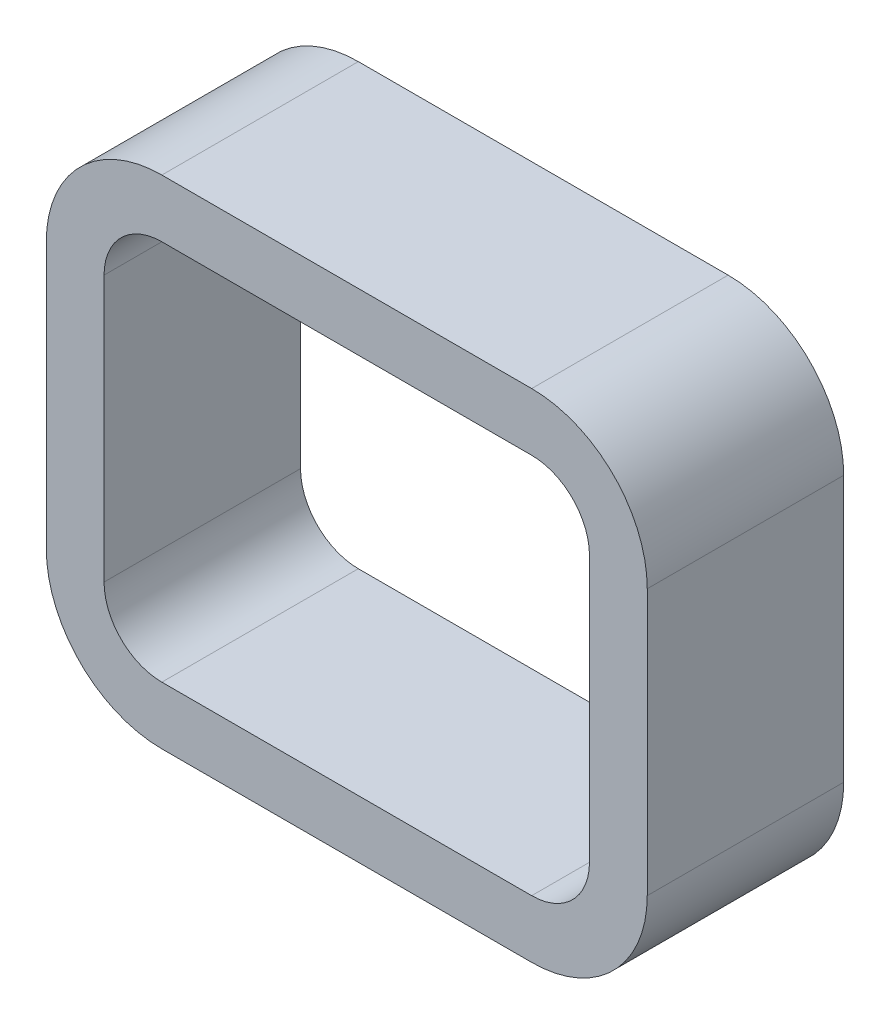
ISO-10303-21;
HEADER;
FILE_DESCRIPTION(('STEP AP214'),'2;1');
FILE_NAME('part.step','',(''),(''),'','','');
FILE_SCHEMA(('AUTOMOTIVE_DESIGN { 1 0 10303 214 1 1 1 1 }'));
ENDSEC;
DATA;
#1=APPLICATION_CONTEXT('core data for automotive mechanical design processes');
#2=APPLICATION_PROTOCOL_DEFINITION('international standard','automotive_design',2000,#1);
#3=PRODUCT_CONTEXT('',#1,'mechanical');
#4=PRODUCT('Part','Part','',(#3));
#5=PRODUCT_RELATED_PRODUCT_CATEGORY('part','',(#4));
#6=PRODUCT_DEFINITION_FORMATION('','',#4);
#7=PRODUCT_DEFINITION_CONTEXT('part definition',#1,'design');
#8=PRODUCT_DEFINITION('design','',#6,#7);
#9=PRODUCT_DEFINITION_SHAPE('','',#8);
#10=(LENGTH_UNIT() NAMED_UNIT(*) SI_UNIT(.MILLI.,.METRE.));
#11=(NAMED_UNIT(*) PLANE_ANGLE_UNIT() SI_UNIT($,.RADIAN.));
#12=(NAMED_UNIT(*) SI_UNIT($,.STERADIAN.) SOLID_ANGLE_UNIT());
#13=UNCERTAINTY_MEASURE_WITH_UNIT(LENGTH_MEASURE(1.E-05),#10,'distance_accuracy_value','');
#14=(GEOMETRIC_REPRESENTATION_CONTEXT(3) GLOBAL_UNCERTAINTY_ASSIGNED_CONTEXT((#13)) GLOBAL_UNIT_ASSIGNED_CONTEXT((#10,
#11,#12)) REPRESENTATION_CONTEXT('',''));
#15=CARTESIAN_POINT('',(0.,0.,0.));
#16=DIRECTION('',(0.,0.,1.));
#17=DIRECTION('',(1.,0.,0.));
#18=AXIS2_PLACEMENT_3D('',#15,#16,#17);
#19=CARTESIAN_POINT('',(-33.2076790853855,15.8631656598667,17.));
#20=DIRECTION('',(0.,0.,1.));
#21=DIRECTION('',(1.,0.,0.));
#22=AXIS2_PLACEMENT_3D('',#19,#20,#21);
#23=PLANE('',#22);
#24=CARTESIAN_POINT('',(-33.2076790853855,15.8631656598667,17.));
#25=DIRECTION('',(0.,0.,1.));
#26=DIRECTION('',(1.,0.,0.));
#27=AXIS2_PLACEMENT_3D('',#24,#25,#26);
#28=CIRCLE('',#27,10.);
#29=CARTESIAN_POINT('',(-33.2076790853855,25.8631656598667,17.));
#30=VERTEX_POINT('',#29);
#31=CARTESIAN_POINT('',(-43.2076790853855,15.8631656598667,17.));
#32=VERTEX_POINT('',#31);
#33=EDGE_CURVE('E258',#30,#32,#28,.T.);
#34=ORIENTED_EDGE('',*,*,#33,.T.);
#35=DIRECTION('',(0.,-1.,0.));
#36=VECTOR('',#35,1.);
#37=CARTESIAN_POINT('',(-43.2076790853855,15.8631656598667,17.));
#38=LINE('',#37,#36);
#39=CARTESIAN_POINT('',(-43.2076790853855,-7.13683434013332,17.));
#40=VERTEX_POINT('',#39);
#41=EDGE_CURVE('E261',#32,#40,#38,.T.);
#42=ORIENTED_EDGE('',*,*,#41,.T.);
#43=CARTESIAN_POINT('',(-33.2076790853855,-7.13683434013332,17.));
#44=DIRECTION('',(0.,0.,1.));
#45=DIRECTION('',(1.,0.,0.));
#46=AXIS2_PLACEMENT_3D('',#43,#44,#45);
#47=CIRCLE('',#46,10.);
#48=CARTESIAN_POINT('',(-33.2076790853855,-17.1368343401333,17.));
#49=VERTEX_POINT('',#48);
#50=EDGE_CURVE('E264',#40,#49,#47,.T.);
#51=ORIENTED_EDGE('',*,*,#50,.T.);
#52=DIRECTION('',(1.,0.,0.));
#53=VECTOR('',#52,1.);
#54=CARTESIAN_POINT('',(-1.20767908538554,-17.1368343401333,17.));
#55=LINE('',#54,#53);
#56=CARTESIAN_POINT('',(-1.20767908538554,-17.1368343401333,17.));
#57=VERTEX_POINT('',#56);
#58=EDGE_CURVE('E266',#49,#57,#55,.T.);
#59=ORIENTED_EDGE('',*,*,#58,.T.);
#60=CARTESIAN_POINT('',(-1.20767908538554,-7.13683434013332,17.));
#61=DIRECTION('',(0.,0.,1.));
#62=DIRECTION('',(1.,0.,0.));
#63=AXIS2_PLACEMENT_3D('',#60,#61,#62);
#64=CIRCLE('',#63,10.);
#65=CARTESIAN_POINT('',(8.79232091461447,-7.13683434013331,17.));
#66=VERTEX_POINT('',#65);
#67=EDGE_CURVE('E268',#57,#66,#64,.T.);
#68=ORIENTED_EDGE('',*,*,#67,.T.);
#69=DIRECTION('',(0.,1.,0.));
#70=VECTOR('',#69,1.);
#71=CARTESIAN_POINT('',(8.79232091461446,15.8631656598667,17.));
#72=LINE('',#71,#70);
#73=CARTESIAN_POINT('',(8.79232091461446,15.8631656598667,17.));
#74=VERTEX_POINT('',#73);
#75=EDGE_CURVE('E270',#66,#74,#72,.T.);
#76=ORIENTED_EDGE('',*,*,#75,.T.);
#77=CARTESIAN_POINT('',(-1.20767908538554,15.8631656598667,17.));
#78=DIRECTION('',(0.,0.,1.));
#79=DIRECTION('',(1.,0.,0.));
#80=AXIS2_PLACEMENT_3D('',#77,#78,#79);
#81=CIRCLE('',#80,10.);
#82=CARTESIAN_POINT('',(-1.20767908538554,25.8631656598667,17.));
#83=VERTEX_POINT('',#82);
#84=EDGE_CURVE('E272',#74,#83,#81,.T.);
#85=ORIENTED_EDGE('',*,*,#84,.T.);
#86=DIRECTION('',(-1.,0.,0.));
#87=VECTOR('',#86,1.);
#88=CARTESIAN_POINT('',(-1.20767908538554,25.8631656598667,17.));
#89=LINE('',#88,#87);
#90=EDGE_CURVE('E274',#83,#30,#89,.T.);
#91=ORIENTED_EDGE('',*,*,#90,.T.);
#92=EDGE_LOOP('',(#34,#42,#51,#59,#68,#76,#85,#91));
#93=FACE_BOUND('',#92,.T.);
#94=DIRECTION('',(0.,-1.,0.));
#95=VECTOR('',#94,1.);
#96=CARTESIAN_POINT('',(-38.2076790853855,15.8631656598667,17.));
#97=LINE('',#96,#95);
#98=CARTESIAN_POINT('',(-38.2076790853855,15.8631656598667,17.));
#99=VERTEX_POINT('',#98);
#100=CARTESIAN_POINT('',(-38.2076790853855,-7.13683434013332,17.));
#101=VERTEX_POINT('',#100);
#102=EDGE_CURVE('E201',#99,#101,#97,.T.);
#103=ORIENTED_EDGE('',*,*,#102,.F.);
#104=CARTESIAN_POINT('',(-33.2076790853855,15.8631656598667,17.));
#105=DIRECTION('',(0.,0.,1.));
#106=DIRECTION('',(1.,0.,0.));
#107=AXIS2_PLACEMENT_3D('',#104,#105,#106);
#108=CIRCLE('',#107,5.);
#109=CARTESIAN_POINT('',(-33.2076790853855,20.8631656598667,17.));
#110=VERTEX_POINT('',#109);
#111=EDGE_CURVE('E193',#110,#99,#108,.T.);
#112=ORIENTED_EDGE('',*,*,#111,.F.);
#113=DIRECTION('',(-1.,0.,0.));
#114=VECTOR('',#113,1.);
#115=CARTESIAN_POINT('',(-1.20767908538554,20.8631656598667,17.));
#116=LINE('',#115,#114);
#117=CARTESIAN_POINT('',(-1.20767908538554,20.8631656598667,17.));
#118=VERTEX_POINT('',#117);
#119=EDGE_CURVE('E226',#118,#110,#116,.T.);
#120=ORIENTED_EDGE('',*,*,#119,.F.);
#121=CARTESIAN_POINT('',(-1.20767908538554,15.8631656598667,17.));
#122=DIRECTION('',(0.,0.,1.));
#123=DIRECTION('',(-1.,0.,0.));
#124=AXIS2_PLACEMENT_3D('',#121,#122,#123);
#125=CIRCLE('',#124,5.);
#126=CARTESIAN_POINT('',(3.79232091461446,15.8631656598667,17.));
#127=VERTEX_POINT('',#126);
#128=EDGE_CURVE('E224',#127,#118,#125,.T.);
#129=ORIENTED_EDGE('',*,*,#128,.F.);
#130=DIRECTION('',(0.,1.,0.));
#131=VECTOR('',#130,1.);
#132=CARTESIAN_POINT('',(3.79232091461446,15.8631656598667,17.));
#133=LINE('',#132,#131);
#134=CARTESIAN_POINT('',(3.79232091461446,-7.13683434013332,17.));
#135=VERTEX_POINT('',#134);
#136=EDGE_CURVE('E222',#135,#127,#133,.T.);
#137=ORIENTED_EDGE('',*,*,#136,.F.);
#138=CARTESIAN_POINT('',(-1.20767908538554,-7.13683434013332,17.));
#139=DIRECTION('',(0.,0.,1.));
#140=DIRECTION('',(-1.,0.,0.));
#141=AXIS2_PLACEMENT_3D('',#138,#139,#140);
#142=CIRCLE('',#141,5.);
#143=CARTESIAN_POINT('',(-1.20767908538554,-12.1368343401333,17.));
#144=VERTEX_POINT('',#143);
#145=EDGE_CURVE('E220',#144,#135,#142,.T.);
#146=ORIENTED_EDGE('',*,*,#145,.F.);
#147=DIRECTION('',(1.,0.,0.));
#148=VECTOR('',#147,1.);
#149=CARTESIAN_POINT('',(-1.20767908538554,-12.1368343401333,17.));
#150=LINE('',#149,#148);
#151=CARTESIAN_POINT('',(-33.2076790853855,-12.1368343401333,17.));
#152=VERTEX_POINT('',#151);
#153=EDGE_CURVE('E216',#152,#144,#150,.T.);
#154=ORIENTED_EDGE('',*,*,#153,.F.);
#155=CARTESIAN_POINT('',(-33.2076790853855,-7.13683434013332,17.));
#156=DIRECTION('',(0.,0.,1.));
#157=DIRECTION('',(-1.,0.,0.));
#158=AXIS2_PLACEMENT_3D('',#155,#156,#157);
#159=CIRCLE('',#158,5.00000000000001);
#160=EDGE_CURVE('E214',#101,#152,#159,.T.);
#161=ORIENTED_EDGE('',*,*,#160,.F.);
#162=EDGE_LOOP('',(#103,#112,#120,#129,#137,#146,#154,#161));
#163=FACE_BOUND('',#162,.T.);
#164=ADVANCED_FACE('F80',(#93,#163),#23,.T.);
#165=CARTESIAN_POINT('',(-33.2076790853855,15.8631656598667,0.));
#166=DIRECTION('',(0.,0.,1.));
#167=DIRECTION('',(1.,0.,0.));
#168=AXIS2_PLACEMENT_3D('',#165,#166,#167);
#169=PLANE('',#168);
#170=CARTESIAN_POINT('',(-33.2076790853855,15.8631656598667,0.));
#171=DIRECTION('',(0.,0.,1.));
#172=DIRECTION('',(1.,0.,0.));
#173=AXIS2_PLACEMENT_3D('',#170,#171,#172);
#174=CIRCLE('',#173,10.);
#175=CARTESIAN_POINT('',(-33.2076790853855,25.8631656598667,0.));
#176=VERTEX_POINT('',#175);
#177=CARTESIAN_POINT('',(-43.2076790853855,15.8631656598667,0.));
#178=VERTEX_POINT('',#177);
#179=EDGE_CURVE('E209',#176,#178,#174,.T.);
#180=ORIENTED_EDGE('',*,*,#179,.F.);
#181=DIRECTION('',(-1.,0.,0.));
#182=VECTOR('',#181,1.);
#183=CARTESIAN_POINT('',(-1.20767908538554,25.8631656598667,0.));
#184=LINE('',#183,#182);
#185=CARTESIAN_POINT('',(-1.20767908538554,25.8631656598667,0.));
#186=VERTEX_POINT('',#185);
#187=EDGE_CURVE('E262',#186,#176,#184,.T.);
#188=ORIENTED_EDGE('',*,*,#187,.F.);
#189=CARTESIAN_POINT('',(-1.20767908538554,15.8631656598667,0.));
#190=DIRECTION('',(0.,0.,1.));
#191=DIRECTION('',(1.,0.,0.));
#192=AXIS2_PLACEMENT_3D('',#189,#190,#191);
#193=CIRCLE('',#192,10.);
#194=CARTESIAN_POINT('',(8.79232091461446,15.8631656598667,0.));
#195=VERTEX_POINT('',#194);
#196=EDGE_CURVE('E289',#195,#186,#193,.T.);
#197=ORIENTED_EDGE('',*,*,#196,.F.);
#198=DIRECTION('',(0.,1.,0.));
#199=VECTOR('',#198,1.);
#200=CARTESIAN_POINT('',(8.79232091461446,15.8631656598667,0.));
#201=LINE('',#200,#199);
#202=CARTESIAN_POINT('',(8.79232091461447,-7.13683434013331,0.));
#203=VERTEX_POINT('',#202);
#204=EDGE_CURVE('E287',#203,#195,#201,.T.);
#205=ORIENTED_EDGE('',*,*,#204,.F.);
#206=CARTESIAN_POINT('',(-1.20767908538554,-7.13683434013332,0.));
#207=DIRECTION('',(0.,0.,1.));
#208=DIRECTION('',(1.,0.,0.));
#209=AXIS2_PLACEMENT_3D('',#206,#207,#208);
#210=CIRCLE('',#209,10.);
#211=CARTESIAN_POINT('',(-1.20767908538554,-17.1368343401333,0.));
#212=VERTEX_POINT('',#211);
#213=EDGE_CURVE('E285',#212,#203,#210,.T.);
#214=ORIENTED_EDGE('',*,*,#213,.F.);
#215=DIRECTION('',(1.,0.,0.));
#216=VECTOR('',#215,1.);
#217=CARTESIAN_POINT('',(-1.20767908538554,-17.1368343401333,0.));
#218=LINE('',#217,#216);
#219=CARTESIAN_POINT('',(-33.2076790853855,-17.1368343401333,0.));
#220=VERTEX_POINT('',#219);
#221=EDGE_CURVE('E283',#220,#212,#218,.T.);
#222=ORIENTED_EDGE('',*,*,#221,.F.);
#223=CARTESIAN_POINT('',(-33.2076790853855,-7.13683434013332,0.));
#224=DIRECTION('',(0.,0.,1.));
#225=DIRECTION('',(1.,0.,0.));
#226=AXIS2_PLACEMENT_3D('',#223,#224,#225);
#227=CIRCLE('',#226,10.);
#228=CARTESIAN_POINT('',(-43.2076790853855,-7.13683434013332,0.));
#229=VERTEX_POINT('',#228);
#230=EDGE_CURVE('E281',#229,#220,#227,.T.);
#231=ORIENTED_EDGE('',*,*,#230,.F.);
#232=DIRECTION('',(0.,-1.,0.));
#233=VECTOR('',#232,1.);
#234=CARTESIAN_POINT('',(-43.2076790853855,15.8631656598667,0.));
#235=LINE('',#234,#233);
#236=EDGE_CURVE('E279',#178,#229,#235,.T.);
#237=ORIENTED_EDGE('',*,*,#236,.F.);
#238=EDGE_LOOP('',(#180,#188,#197,#205,#214,#222,#231,#237));
#239=FACE_BOUND('',#238,.T.);
#240=CARTESIAN_POINT('',(-33.2076790853855,15.8631656598667,0.));
#241=DIRECTION('',(0.,0.,1.));
#242=DIRECTION('',(1.,0.,0.));
#243=AXIS2_PLACEMENT_3D('',#240,#241,#242);
#244=CIRCLE('',#243,5.);
#245=CARTESIAN_POINT('',(-33.2076790853855,20.8631656598667,0.));
#246=VERTEX_POINT('',#245);
#247=CARTESIAN_POINT('',(-38.2076790853855,15.8631656598667,0.));
#248=VERTEX_POINT('',#247);
#249=EDGE_CURVE('E103',#246,#248,#244,.T.);
#250=ORIENTED_EDGE('',*,*,#249,.T.);
#251=DIRECTION('',(0.,-1.,0.));
#252=VECTOR('',#251,1.);
#253=CARTESIAN_POINT('',(-38.2076790853855,15.8631656598667,0.));
#254=LINE('',#253,#252);
#255=CARTESIAN_POINT('',(-38.2076790853855,-7.13683434013332,0.));
#256=VERTEX_POINT('',#255);
#257=EDGE_CURVE('E208',#248,#256,#254,.T.);
#258=ORIENTED_EDGE('',*,*,#257,.T.);
#259=CARTESIAN_POINT('',(-33.2076790853855,-7.13683434013332,0.));
#260=DIRECTION('',(0.,0.,1.));
#261=DIRECTION('',(-1.,0.,0.));
#262=AXIS2_PLACEMENT_3D('',#259,#260,#261);
#263=CIRCLE('',#262,5.00000000000001);
#264=CARTESIAN_POINT('',(-33.2076790853855,-12.1368343401333,0.));
#265=VERTEX_POINT('',#264);
#266=EDGE_CURVE('E230',#256,#265,#263,.T.);
#267=ORIENTED_EDGE('',*,*,#266,.T.);
#268=DIRECTION('',(1.,0.,0.));
#269=VECTOR('',#268,1.);
#270=CARTESIAN_POINT('',(-1.20767908538554,-12.1368343401333,0.));
#271=LINE('',#270,#269);
#272=CARTESIAN_POINT('',(-1.20767908538554,-12.1368343401333,0.));
#273=VERTEX_POINT('',#272);
#274=EDGE_CURVE('E233',#265,#273,#271,.T.);
#275=ORIENTED_EDGE('',*,*,#274,.T.);
#276=CARTESIAN_POINT('',(-1.20767908538554,-7.13683434013332,0.));
#277=DIRECTION('',(0.,0.,1.));
#278=DIRECTION('',(-1.,0.,0.));
#279=AXIS2_PLACEMENT_3D('',#276,#277,#278);
#280=CIRCLE('',#279,5.);
#281=CARTESIAN_POINT('',(3.79232091461446,-7.13683434013332,0.));
#282=VERTEX_POINT('',#281);
#283=EDGE_CURVE('E236',#273,#282,#280,.T.);
#284=ORIENTED_EDGE('',*,*,#283,.T.);
#285=DIRECTION('',(0.,1.,0.));
#286=VECTOR('',#285,1.);
#287=CARTESIAN_POINT('',(3.79232091461446,15.8631656598667,0.));
#288=LINE('',#287,#286);
#289=CARTESIAN_POINT('',(3.79232091461446,15.8631656598667,0.));
#290=VERTEX_POINT('',#289);
#291=EDGE_CURVE('E239',#282,#290,#288,.T.);
#292=ORIENTED_EDGE('',*,*,#291,.T.);
#293=CARTESIAN_POINT('',(-1.20767908538554,15.8631656598667,0.));
#294=DIRECTION('',(0.,0.,1.));
#295=DIRECTION('',(-1.,0.,0.));
#296=AXIS2_PLACEMENT_3D('',#293,#294,#295);
#297=CIRCLE('',#296,5.);
#298=CARTESIAN_POINT('',(-1.20767908538554,20.8631656598667,0.));
#299=VERTEX_POINT('',#298);
#300=EDGE_CURVE('E242',#290,#299,#297,.T.);
#301=ORIENTED_EDGE('',*,*,#300,.T.);
#302=DIRECTION('',(-1.,0.,0.));
#303=VECTOR('',#302,1.);
#304=CARTESIAN_POINT('',(-1.20767908538554,20.8631656598667,0.));
#305=LINE('',#304,#303);
#306=EDGE_CURVE('E202',#299,#246,#305,.T.);
#307=ORIENTED_EDGE('',*,*,#306,.T.);
#308=EDGE_LOOP('',(#250,#258,#267,#275,#284,#292,#301,#307));
#309=FACE_BOUND('',#308,.T.);
#310=ADVANCED_FACE('F319',(#239,#309),#169,.F.);
#311=CARTESIAN_POINT('',(-33.2076790853855,15.8631656598667,17.));
#312=DIRECTION('',(0.,0.,-1.));
#313=DIRECTION('',(-1.,0.,0.));
#314=AXIS2_PLACEMENT_3D('',#311,#312,#313);
#315=CYLINDRICAL_SURFACE('',#314,10.);
#316=ORIENTED_EDGE('',*,*,#179,.T.);
#317=DIRECTION('',(0.,0.,-1.));
#318=VECTOR('',#317,1.);
#319=CARTESIAN_POINT('',(-43.2076790853855,15.8631656598667,17.));
#320=LINE('',#319,#318);
#321=EDGE_CURVE('E12',#32,#178,#320,.T.);
#322=ORIENTED_EDGE('',*,*,#321,.F.);
#323=ORIENTED_EDGE('',*,*,#33,.F.);
#324=DIRECTION('',(0.,0.,-1.));
#325=VECTOR('',#324,1.);
#326=CARTESIAN_POINT('',(-33.2076790853855,25.8631656598667,17.));
#327=LINE('',#326,#325);
#328=EDGE_CURVE('E276',#30,#176,#327,.T.);
#329=ORIENTED_EDGE('',*,*,#328,.T.);
#330=EDGE_LOOP('',(#316,#322,#323,#329));
#331=FACE_BOUND('',#330,.T.);
#332=ADVANCED_FACE('F82',(#331),#315,.T.);
#333=CARTESIAN_POINT('',(-43.2076790853855,15.8631656598667,17.));
#334=DIRECTION('',(1.,0.,0.));
#335=DIRECTION('',(0.,1.,0.));
#336=AXIS2_PLACEMENT_3D('',#333,#334,#335);
#337=PLANE('',#336);
#338=ORIENTED_EDGE('',*,*,#236,.T.);
#339=DIRECTION('',(0.,0.,-1.));
#340=VECTOR('',#339,1.);
#341=CARTESIAN_POINT('',(-43.2076790853855,-7.13683434013332,17.));
#342=LINE('',#341,#340);
#343=EDGE_CURVE('E88',#40,#229,#342,.T.);
#344=ORIENTED_EDGE('',*,*,#343,.F.);
#345=ORIENTED_EDGE('',*,*,#41,.F.);
#346=ORIENTED_EDGE('',*,*,#321,.T.);
#347=EDGE_LOOP('',(#338,#344,#345,#346));
#348=FACE_BOUND('',#347,.T.);
#349=ADVANCED_FACE('F336',(#348),#337,.F.);
#350=CARTESIAN_POINT('',(-33.2076790853855,-7.13683434013332,17.));
#351=DIRECTION('',(0.,0.,-1.));
#352=DIRECTION('',(-1.,0.,0.));
#353=AXIS2_PLACEMENT_3D('',#350,#351,#352);
#354=CYLINDRICAL_SURFACE('',#353,10.);
#355=ORIENTED_EDGE('',*,*,#230,.T.);
#356=DIRECTION('',(0.,0.,-1.));
#357=VECTOR('',#356,1.);
#358=CARTESIAN_POINT('',(-33.2076790853855,-17.1368343401333,17.));
#359=LINE('',#358,#357);
#360=EDGE_CURVE('E306',#49,#220,#359,.T.);
#361=ORIENTED_EDGE('',*,*,#360,.F.);
#362=ORIENTED_EDGE('',*,*,#50,.F.);
#363=ORIENTED_EDGE('',*,*,#343,.T.);
#364=EDGE_LOOP('',(#355,#361,#362,#363));
#365=FACE_BOUND('',#364,.T.);
#366=ADVANCED_FACE('F313',(#365),#354,.T.);
#367=CARTESIAN_POINT('',(-1.20767908538554,-17.1368343401333,17.));
#368=DIRECTION('',(0.,1.,0.));
#369=DIRECTION('',(-1.,0.,0.));
#370=AXIS2_PLACEMENT_3D('',#367,#368,#369);
#371=PLANE('',#370);
#372=ORIENTED_EDGE('',*,*,#221,.T.);
#373=DIRECTION('',(0.,0.,-1.));
#374=VECTOR('',#373,1.);
#375=CARTESIAN_POINT('',(-1.20767908538554,-17.1368343401333,17.));
#376=LINE('',#375,#374);
#377=EDGE_CURVE('E303',#57,#212,#376,.T.);
#378=ORIENTED_EDGE('',*,*,#377,.F.);
#379=ORIENTED_EDGE('',*,*,#58,.F.);
#380=ORIENTED_EDGE('',*,*,#360,.T.);
#381=EDGE_LOOP('',(#372,#378,#379,#380));
#382=FACE_BOUND('',#381,.T.);
#383=ADVANCED_FACE('F325',(#382),#371,.F.);
#384=CARTESIAN_POINT('',(-1.20767908538554,-7.13683434013332,17.));
#385=DIRECTION('',(0.,0.,-1.));
#386=DIRECTION('',(-1.,0.,0.));
#387=AXIS2_PLACEMENT_3D('',#384,#385,#386);
#388=CYLINDRICAL_SURFACE('',#387,10.);
#389=ORIENTED_EDGE('',*,*,#213,.T.);
#390=DIRECTION('',(0.,0.,-1.));
#391=VECTOR('',#390,1.);
#392=CARTESIAN_POINT('',(8.79232091461447,-7.13683434013331,17.));
#393=LINE('',#392,#391);
#394=EDGE_CURVE('E300',#66,#203,#393,.T.);
#395=ORIENTED_EDGE('',*,*,#394,.F.);
#396=ORIENTED_EDGE('',*,*,#67,.F.);
#397=ORIENTED_EDGE('',*,*,#377,.T.);
#398=EDGE_LOOP('',(#389,#395,#396,#397));
#399=FACE_BOUND('',#398,.T.);
#400=ADVANCED_FACE('F329',(#399),#388,.T.);
#401=CARTESIAN_POINT('',(8.79232091461446,15.8631656598667,17.));
#402=DIRECTION('',(-1.,0.,0.));
#403=DIRECTION('',(0.,-1.,0.));
#404=AXIS2_PLACEMENT_3D('',#401,#402,#403);
#405=PLANE('',#404);
#406=ORIENTED_EDGE('',*,*,#204,.T.);
#407=DIRECTION('',(0.,0.,-1.));
#408=VECTOR('',#407,1.);
#409=CARTESIAN_POINT('',(8.79232091461446,15.8631656598667,17.));
#410=LINE('',#409,#408);
#411=EDGE_CURVE('E297',#74,#195,#410,.T.);
#412=ORIENTED_EDGE('',*,*,#411,.F.);
#413=ORIENTED_EDGE('',*,*,#75,.F.);
#414=ORIENTED_EDGE('',*,*,#394,.T.);
#415=EDGE_LOOP('',(#406,#412,#413,#414));
#416=FACE_BOUND('',#415,.T.);
#417=ADVANCED_FACE('F349',(#416),#405,.F.);
#418=CARTESIAN_POINT('',(-1.20767908538554,15.8631656598667,17.));
#419=DIRECTION('',(0.,0.,-1.));
#420=DIRECTION('',(-1.,0.,0.));
#421=AXIS2_PLACEMENT_3D('',#418,#419,#420);
#422=CYLINDRICAL_SURFACE('',#421,10.);
#423=ORIENTED_EDGE('',*,*,#196,.T.);
#424=DIRECTION('',(0.,0.,-1.));
#425=VECTOR('',#424,1.);
#426=CARTESIAN_POINT('',(-1.20767908538554,25.8631656598667,17.));
#427=LINE('',#426,#425);
#428=EDGE_CURVE('E294',#83,#186,#427,.T.);
#429=ORIENTED_EDGE('',*,*,#428,.F.);
#430=ORIENTED_EDGE('',*,*,#84,.F.);
#431=ORIENTED_EDGE('',*,*,#411,.T.);
#432=EDGE_LOOP('',(#423,#429,#430,#431));
#433=FACE_BOUND('',#432,.T.);
#434=ADVANCED_FACE('F347',(#433),#422,.T.);
#435=CARTESIAN_POINT('',(-1.20767908538554,25.8631656598667,17.));
#436=DIRECTION('',(0.,-1.,0.));
#437=DIRECTION('',(0.,0.,-1.));
#438=AXIS2_PLACEMENT_3D('',#435,#436,#437);
#439=PLANE('',#438);
#440=ORIENTED_EDGE('',*,*,#187,.T.);
#441=ORIENTED_EDGE('',*,*,#328,.F.);
#442=ORIENTED_EDGE('',*,*,#90,.F.);
#443=ORIENTED_EDGE('',*,*,#428,.T.);
#444=EDGE_LOOP('',(#440,#441,#442,#443));
#445=FACE_BOUND('',#444,.T.);
#446=ADVANCED_FACE('F342',(#445),#439,.F.);
#447=CARTESIAN_POINT('',(-33.2076790853855,15.8631656598667,17.));
#448=DIRECTION('',(0.,0.,-1.));
#449=DIRECTION('',(-1.,0.,0.));
#450=AXIS2_PLACEMENT_3D('',#447,#448,#449);
#451=CYLINDRICAL_SURFACE('',#450,5.);
#452=ORIENTED_EDGE('',*,*,#249,.F.);
#453=DIRECTION('',(0.,0.,-1.));
#454=VECTOR('',#453,1.);
#455=CARTESIAN_POINT('',(-33.2076790853855,20.8631656598667,17.));
#456=LINE('',#455,#454);
#457=EDGE_CURVE('E197',#110,#246,#456,.T.);
#458=ORIENTED_EDGE('',*,*,#457,.F.);
#459=ORIENTED_EDGE('',*,*,#111,.T.);
#460=DIRECTION('',(0.,0.,-1.));
#461=VECTOR('',#460,1.);
#462=CARTESIAN_POINT('',(-38.2076790853855,15.8631656598667,17.));
#463=LINE('',#462,#461);
#464=EDGE_CURVE('E196',#99,#248,#463,.T.);
#465=ORIENTED_EDGE('',*,*,#464,.T.);
#466=EDGE_LOOP('',(#452,#458,#459,#465));
#467=FACE_BOUND('',#466,.T.);
#468=ADVANCED_FACE('F195',(#467),#451,.F.);
#469=CARTESIAN_POINT('',(-38.2076790853855,15.8631656598667,17.));
#470=DIRECTION('',(1.,0.,0.));
#471=DIRECTION('',(0.,1.,0.));
#472=AXIS2_PLACEMENT_3D('',#469,#470,#471);
#473=PLANE('',#472);
#474=ORIENTED_EDGE('',*,*,#257,.F.);
#475=ORIENTED_EDGE('',*,*,#464,.F.);
#476=ORIENTED_EDGE('',*,*,#102,.T.);
#477=DIRECTION('',(0.,0.,-1.));
#478=VECTOR('',#477,1.);
#479=CARTESIAN_POINT('',(-38.2076790853855,-7.13683434013332,17.));
#480=LINE('',#479,#478);
#481=EDGE_CURVE('E210',#101,#256,#480,.T.);
#482=ORIENTED_EDGE('',*,*,#481,.T.);
#483=EDGE_LOOP('',(#474,#475,#476,#482));
#484=FACE_BOUND('',#483,.T.);
#485=ADVANCED_FACE('F205',(#484),#473,.T.);
#486=CARTESIAN_POINT('',(-33.2076790853855,-7.13683434013332,17.));
#487=DIRECTION('',(0.,0.,-1.));
#488=DIRECTION('',(-1.,0.,0.));
#489=AXIS2_PLACEMENT_3D('',#486,#487,#488);
#490=CYLINDRICAL_SURFACE('',#489,5.00000000000001);
#491=ORIENTED_EDGE('',*,*,#266,.F.);
#492=ORIENTED_EDGE('',*,*,#481,.F.);
#493=ORIENTED_EDGE('',*,*,#160,.T.);
#494=DIRECTION('',(0.,0.,-1.));
#495=VECTOR('',#494,1.);
#496=CARTESIAN_POINT('',(-33.2076790853855,-12.1368343401333,17.));
#497=LINE('',#496,#495);
#498=EDGE_CURVE('E255',#152,#265,#497,.T.);
#499=ORIENTED_EDGE('',*,*,#498,.T.);
#500=EDGE_LOOP('',(#491,#492,#493,#499));
#501=FACE_BOUND('',#500,.T.);
#502=ADVANCED_FACE('F374',(#501),#490,.F.);
#503=CARTESIAN_POINT('',(-1.20767908538554,-12.1368343401333,17.));
#504=DIRECTION('',(0.,1.,0.));
#505=DIRECTION('',(-1.,0.,0.));
#506=AXIS2_PLACEMENT_3D('',#503,#504,#505);
#507=PLANE('',#506);
#508=ORIENTED_EDGE('',*,*,#274,.F.);
#509=ORIENTED_EDGE('',*,*,#498,.F.);
#510=ORIENTED_EDGE('',*,*,#153,.T.);
#511=DIRECTION('',(0.,0.,-1.));
#512=VECTOR('',#511,1.);
#513=CARTESIAN_POINT('',(-1.20767908538554,-12.1368343401333,17.));
#514=LINE('',#513,#512);
#515=EDGE_CURVE('E253',#144,#273,#514,.T.);
#516=ORIENTED_EDGE('',*,*,#515,.T.);
#517=EDGE_LOOP('',(#508,#509,#510,#516));
#518=FACE_BOUND('',#517,.T.);
#519=ADVANCED_FACE('F378',(#518),#507,.T.);
#520=CARTESIAN_POINT('',(-1.20767908538554,-7.13683434013332,17.));
#521=DIRECTION('',(0.,0.,-1.));
#522=DIRECTION('',(-1.,0.,0.));
#523=AXIS2_PLACEMENT_3D('',#520,#521,#522);
#524=CYLINDRICAL_SURFACE('',#523,5.);
#525=ORIENTED_EDGE('',*,*,#283,.F.);
#526=ORIENTED_EDGE('',*,*,#515,.F.);
#527=ORIENTED_EDGE('',*,*,#145,.T.);
#528=DIRECTION('',(0.,0.,-1.));
#529=VECTOR('',#528,1.);
#530=CARTESIAN_POINT('',(3.79232091461446,-7.13683434013332,17.));
#531=LINE('',#530,#529);
#532=EDGE_CURVE('E251',#135,#282,#531,.T.);
#533=ORIENTED_EDGE('',*,*,#532,.T.);
#534=EDGE_LOOP('',(#525,#526,#527,#533));
#535=FACE_BOUND('',#534,.T.);
#536=ADVANCED_FACE('F384',(#535),#524,.F.);
#537=CARTESIAN_POINT('',(3.79232091461446,15.8631656598667,17.));
#538=DIRECTION('',(-1.,0.,0.));
#539=DIRECTION('',(0.,-1.,0.));
#540=AXIS2_PLACEMENT_3D('',#537,#538,#539);
#541=PLANE('',#540);
#542=ORIENTED_EDGE('',*,*,#291,.F.);
#543=ORIENTED_EDGE('',*,*,#532,.F.);
#544=ORIENTED_EDGE('',*,*,#136,.T.);
#545=DIRECTION('',(0.,0.,-1.));
#546=VECTOR('',#545,1.);
#547=CARTESIAN_POINT('',(3.79232091461446,15.8631656598667,17.));
#548=LINE('',#547,#546);
#549=EDGE_CURVE('E249',#127,#290,#548,.T.);
#550=ORIENTED_EDGE('',*,*,#549,.T.);
#551=EDGE_LOOP('',(#542,#543,#544,#550));
#552=FACE_BOUND('',#551,.T.);
#553=ADVANCED_FACE('F388',(#552),#541,.T.);
#554=CARTESIAN_POINT('',(-1.20767908538554,15.8631656598667,17.));
#555=DIRECTION('',(0.,0.,-1.));
#556=DIRECTION('',(-1.,0.,0.));
#557=AXIS2_PLACEMENT_3D('',#554,#555,#556);
#558=CYLINDRICAL_SURFACE('',#557,5.);
#559=ORIENTED_EDGE('',*,*,#300,.F.);
#560=ORIENTED_EDGE('',*,*,#549,.F.);
#561=ORIENTED_EDGE('',*,*,#128,.T.);
#562=DIRECTION('',(0.,0.,-1.));
#563=VECTOR('',#562,1.);
#564=CARTESIAN_POINT('',(-1.20767908538554,20.8631656598667,17.));
#565=LINE('',#564,#563);
#566=EDGE_CURVE('E95',#118,#299,#565,.T.);
#567=ORIENTED_EDGE('',*,*,#566,.T.);
#568=EDGE_LOOP('',(#559,#560,#561,#567));
#569=FACE_BOUND('',#568,.T.);
#570=ADVANCED_FACE('F392',(#569),#558,.F.);
#571=CARTESIAN_POINT('',(-1.20767908538554,20.8631656598667,17.));
#572=DIRECTION('',(0.,-1.,0.));
#573=DIRECTION('',(0.,0.,-1.));
#574=AXIS2_PLACEMENT_3D('',#571,#572,#573);
#575=PLANE('',#574);
#576=ORIENTED_EDGE('',*,*,#306,.F.);
#577=ORIENTED_EDGE('',*,*,#566,.F.);
#578=ORIENTED_EDGE('',*,*,#119,.T.);
#579=ORIENTED_EDGE('',*,*,#457,.T.);
#580=EDGE_LOOP('',(#576,#577,#578,#579));
#581=FACE_BOUND('',#580,.T.);
#582=ADVANCED_FACE('F396',(#581),#575,.T.);
#583=CLOSED_SHELL('',(#164,#310,#332,#349,#366,#383,#400,#417,#434,#446,#468,#485,#502,#519,
#536,#553,#570,#582));
#584=MANIFOLD_SOLID_BREP('B2',#583);
#585=ADVANCED_BREP_SHAPE_REPRESENTATION('',(#18,#584),#14);
#586=SHAPE_DEFINITION_REPRESENTATION(#9,#585);
ENDSEC;
END-ISO-10303-21;
